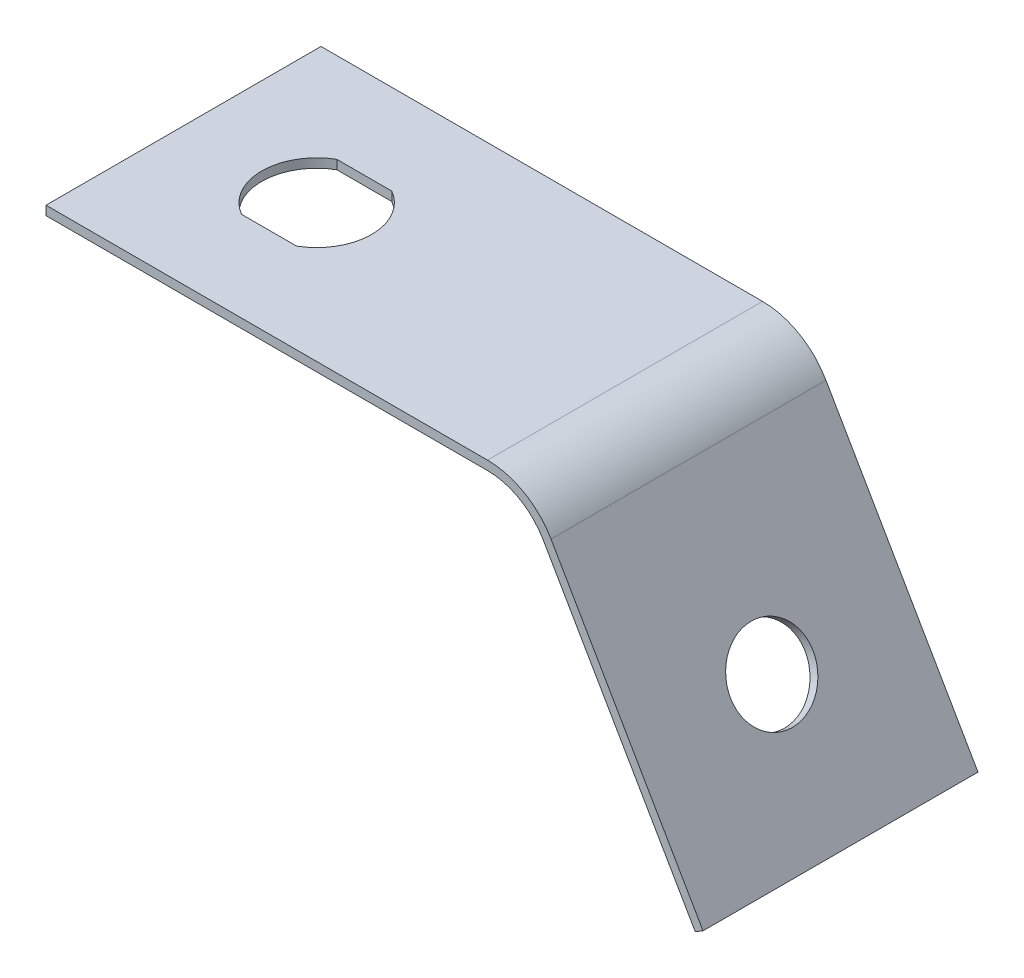
ISO-10303-21;
HEADER;
FILE_DESCRIPTION(('STEP AP214'),'2;1');
FILE_NAME('part.step','',(''),(''),'','','');
FILE_SCHEMA(('AUTOMOTIVE_DESIGN { 1 0 10303 214 1 1 1 1 }'));
ENDSEC;
DATA;
#1=APPLICATION_CONTEXT('core data for automotive mechanical design processes');
#2=APPLICATION_PROTOCOL_DEFINITION('international standard','automotive_design',2000,#1);
#3=PRODUCT_CONTEXT('',#1,'mechanical');
#4=PRODUCT('Part','Part','',(#3));
#5=PRODUCT_RELATED_PRODUCT_CATEGORY('part','',(#4));
#6=PRODUCT_DEFINITION_FORMATION('','',#4);
#7=PRODUCT_DEFINITION_CONTEXT('part definition',#1,'design');
#8=PRODUCT_DEFINITION('design','',#6,#7);
#9=PRODUCT_DEFINITION_SHAPE('','',#8);
#10=(LENGTH_UNIT() NAMED_UNIT(*) SI_UNIT(.MILLI.,.METRE.));
#11=(NAMED_UNIT(*) PLANE_ANGLE_UNIT() SI_UNIT($,.RADIAN.));
#12=(NAMED_UNIT(*) SI_UNIT($,.STERADIAN.) SOLID_ANGLE_UNIT());
#13=UNCERTAINTY_MEASURE_WITH_UNIT(LENGTH_MEASURE(1.E-05),#10,'distance_accuracy_value','');
#14=(GEOMETRIC_REPRESENTATION_CONTEXT(3) GLOBAL_UNCERTAINTY_ASSIGNED_CONTEXT((#13)) GLOBAL_UNIT_ASSIGNED_CONTEXT((#10,
#11,#12)) REPRESENTATION_CONTEXT('',''));
#15=CARTESIAN_POINT('',(0.,0.,0.));
#16=DIRECTION('',(0.,0.,1.));
#17=DIRECTION('',(1.,0.,0.));
#18=AXIS2_PLACEMENT_3D('',#15,#16,#17);
#19=CARTESIAN_POINT('',(1.47013585795091,-3.38455000000012,12.7));
#20=DIRECTION('',(0.866025403784439,0.5,0.));
#21=DIRECTION('',(-0.5,0.866025403784439,0.));
#22=AXIS2_PLACEMENT_3D('',#19,#20,#21);
#23=PLANE('',#22);
#24=CARTESIAN_POINT('',(9.16204875327383,-16.7073339420937,0.));
#25=DIRECTION('',(-0.866025403784439,-0.5,0.));
#26=DIRECTION('',(0.5,-0.866025403784439,0.));
#27=AXIS2_PLACEMENT_3D('',#24,#25,#26);
#28=CIRCLE('',#27,3.81);
#29=CARTESIAN_POINT('',(11.0670487532738,-20.0068907305124,0.));
#30=VERTEX_POINT('',#29);
#31=EDGE_CURVE('E287',#30,#30,#28,.T.);
#32=ORIENTED_EDGE('',*,*,#31,.F.);
#33=EDGE_LOOP('',(#32));
#34=FACE_BOUND('',#33,.T.);
#35=DIRECTION('',(0.5,-0.866025403784439,0.));
#36=VECTOR('',#35,1.);
#37=CARTESIAN_POINT('',(1.47013585795091,-3.38455000000012,-12.7));
#38=LINE('',#37,#36);
#39=CARTESIAN_POINT('',(1.47013585795091,-3.38455000000012,-12.7));
#40=VERTEX_POINT('',#39);
#41=CARTESIAN_POINT('',(15.5120487532738,-27.705856570156,-12.7));
#42=VERTEX_POINT('',#41);
#43=EDGE_CURVE('E160',#40,#42,#38,.T.);
#44=ORIENTED_EDGE('',*,*,#43,.T.);
#45=DIRECTION('',(0.,0.,-1.));
#46=VECTOR('',#45,1.);
#47=CARTESIAN_POINT('',(15.5120487532738,-27.705856570156,12.7));
#48=LINE('',#47,#46);
#49=CARTESIAN_POINT('',(15.5120487532738,-27.705856570156,12.7));
#50=VERTEX_POINT('',#49);
#51=EDGE_CURVE('E246',#50,#42,#48,.T.);
#52=ORIENTED_EDGE('',*,*,#51,.F.);
#53=DIRECTION('',(0.5,-0.866025403784439,0.));
#54=VECTOR('',#53,1.);
#55=CARTESIAN_POINT('',(1.47013585795091,-3.38455000000012,12.7));
#56=LINE('',#55,#54);
#57=CARTESIAN_POINT('',(1.47013585795091,-3.38455000000012,12.7));
#58=VERTEX_POINT('',#57);
#59=EDGE_CURVE('E165',#58,#50,#56,.T.);
#60=ORIENTED_EDGE('',*,*,#59,.F.);
#61=DIRECTION('',(0.,0.,-1.));
#62=VECTOR('',#61,1.);
#63=CARTESIAN_POINT('',(1.47013585795091,-3.38455000000012,12.7));
#64=LINE('',#63,#62);
#65=EDGE_CURVE('E195',#58,#40,#64,.T.);
#66=ORIENTED_EDGE('',*,*,#65,.T.);
#67=EDGE_LOOP('',(#44,#52,#60,#66));
#68=FACE_BOUND('',#67,.T.);
#69=ADVANCED_FACE('F39',(#34,#68),#23,.F.);
#70=CARTESIAN_POINT('',(16.2379512467259,-27.286756570156,12.7));
#71=DIRECTION('',(0.500000000000003,-0.866025403784437,0.));
#72=DIRECTION('',(0.866025403784437,0.500000000000003,0.));
#73=AXIS2_PLACEMENT_3D('',#70,#71,#72);
#74=PLANE('',#73);
#75=DIRECTION('',(-0.866025403784437,-0.500000000000003,0.));
#76=VECTOR('',#75,1.);
#77=CARTESIAN_POINT('',(16.2379512467259,-27.286756570156,-12.7));
#78=LINE('',#77,#76);
#79=CARTESIAN_POINT('',(16.2379512467259,-27.286756570156,-12.7));
#80=VERTEX_POINT('',#79);
#81=EDGE_CURVE('E199',#80,#42,#78,.T.);
#82=ORIENTED_EDGE('',*,*,#81,.F.);
#83=DIRECTION('',(0.,0.,-1.));
#84=VECTOR('',#83,1.);
#85=CARTESIAN_POINT('',(16.2379512467259,-27.286756570156,12.7));
#86=LINE('',#85,#84);
#87=CARTESIAN_POINT('',(16.2379512467259,-27.286756570156,12.7));
#88=VERTEX_POINT('',#87);
#89=EDGE_CURVE('E243',#88,#80,#86,.T.);
#90=ORIENTED_EDGE('',*,*,#89,.F.);
#91=DIRECTION('',(-0.866025403784437,-0.500000000000003,0.));
#92=VECTOR('',#91,1.);
#93=CARTESIAN_POINT('',(16.2379512467259,-27.286756570156,12.7));
#94=LINE('',#93,#92);
#95=EDGE_CURVE('E168',#88,#50,#94,.T.);
#96=ORIENTED_EDGE('',*,*,#95,.T.);
#97=ORIENTED_EDGE('',*,*,#51,.T.);
#98=EDGE_LOOP('',(#82,#90,#96,#97));
#99=FACE_BOUND('',#98,.T.);
#100=ADVANCED_FACE('F277',(#99),#74,.T.);
#101=CARTESIAN_POINT('',(2.19603835140302,-2.96545000000012,12.7));
#102=DIRECTION('',(0.866025403784439,0.5,0.));
#103=DIRECTION('',(-0.5,0.866025403784439,0.));
#104=AXIS2_PLACEMENT_3D('',#101,#102,#103);
#105=PLANE('',#104);
#106=CARTESIAN_POINT('',(9.88795124672594,-16.2882339420937,0.));
#107=DIRECTION('',(0.866025403784439,0.5,0.));
#108=DIRECTION('',(-0.5,0.866025403784439,0.));
#109=AXIS2_PLACEMENT_3D('',#106,#107,#108);
#110=CIRCLE('',#109,3.81);
#111=CARTESIAN_POINT('',(7.98295124672594,-12.9886771536749,0.));
#112=VERTEX_POINT('',#111);
#113=EDGE_CURVE('E42',#112,#112,#110,.T.);
#114=ORIENTED_EDGE('',*,*,#113,.F.);
#115=EDGE_LOOP('',(#114));
#116=FACE_BOUND('',#115,.T.);
#117=DIRECTION('',(0.5,-0.866025403784439,0.));
#118=VECTOR('',#117,1.);
#119=CARTESIAN_POINT('',(2.19603835140302,-2.96545000000012,-12.7));
#120=LINE('',#119,#118);
#121=CARTESIAN_POINT('',(2.19603835140302,-2.96545000000012,-12.7));
#122=VERTEX_POINT('',#121);
#123=EDGE_CURVE('E203',#122,#80,#120,.T.);
#124=ORIENTED_EDGE('',*,*,#123,.F.);
#125=DIRECTION('',(0.,0.,-1.));
#126=VECTOR('',#125,1.);
#127=CARTESIAN_POINT('',(2.19603835140302,-2.96545000000012,12.7));
#128=LINE('',#127,#126);
#129=CARTESIAN_POINT('',(2.19603835140302,-2.96545000000012,12.7));
#130=VERTEX_POINT('',#129);
#131=EDGE_CURVE('E240',#130,#122,#128,.T.);
#132=ORIENTED_EDGE('',*,*,#131,.F.);
#133=DIRECTION('',(0.5,-0.866025403784439,0.));
#134=VECTOR('',#133,1.);
#135=CARTESIAN_POINT('',(2.19603835140302,-2.96545000000012,12.7));
#136=LINE('',#135,#134);
#137=EDGE_CURVE('E173',#130,#88,#136,.T.);
#138=ORIENTED_EDGE('',*,*,#137,.T.);
#139=ORIENTED_EDGE('',*,*,#89,.T.);
#140=EDGE_LOOP('',(#124,#132,#138,#139));
#141=FACE_BOUND('',#140,.T.);
#142=ADVANCED_FACE('F282',(#116,#141),#105,.T.);
#143=CARTESIAN_POINT('',(-3.66617420935424,-6.3500000000001,12.7));
#144=DIRECTION('',(0.,0.,-1.));
#145=DIRECTION('',(-1.,0.,0.));
#146=AXIS2_PLACEMENT_3D('',#143,#144,#145);
#147=CYLINDRICAL_SURFACE('',#146,6.7691);
#148=CARTESIAN_POINT('',(-3.66617420935424,-6.3500000000001,-12.7));
#149=DIRECTION('',(0.,0.,1.));
#150=DIRECTION('',(1.,0.,0.));
#151=AXIS2_PLACEMENT_3D('',#148,#149,#150);
#152=CIRCLE('',#151,6.7691);
#153=CARTESIAN_POINT('',(-3.66617420935427,0.419099999999904,-12.7));
#154=VERTEX_POINT('',#153);
#155=EDGE_CURVE('E207',#154,#122,#152,.F.);
#156=ORIENTED_EDGE('',*,*,#155,.F.);
#157=DIRECTION('',(0.,0.,-1.));
#158=VECTOR('',#157,1.);
#159=CARTESIAN_POINT('',(-3.66617420935427,0.419099999999904,12.7));
#160=LINE('',#159,#158);
#161=CARTESIAN_POINT('',(-3.66617420935427,0.419099999999904,12.7));
#162=VERTEX_POINT('',#161);
#163=EDGE_CURVE('E237',#162,#154,#160,.T.);
#164=ORIENTED_EDGE('',*,*,#163,.F.);
#165=CARTESIAN_POINT('',(-3.66617420935424,-6.3500000000001,12.7));
#166=DIRECTION('',(0.,0.,1.));
#167=DIRECTION('',(1.,0.,0.));
#168=AXIS2_PLACEMENT_3D('',#165,#166,#167);
#169=CIRCLE('',#168,6.7691);
#170=EDGE_CURVE('E177',#162,#130,#169,.F.);
#171=ORIENTED_EDGE('',*,*,#170,.T.);
#172=ORIENTED_EDGE('',*,*,#131,.T.);
#173=EDGE_LOOP('',(#156,#164,#171,#172));
#174=FACE_BOUND('',#173,.T.);
#175=ADVANCED_FACE('F302',(#174),#147,.T.);
#176=CARTESIAN_POINT('',(-44.4500000000001,0.419099999999903,12.7));
#177=DIRECTION('',(0.,1.,0.));
#178=DIRECTION('',(0.,0.,1.));
#179=AXIS2_PLACEMENT_3D('',#176,#177,#178);
#180=PLANE('',#179);
#181=CARTESIAN_POINT('',(-32.149149884402,0.419099999999903,0.));
#182=DIRECTION('',(0.,1.,0.));
#183=DIRECTION('',(0.,0.,1.));
#184=AXIS2_PLACEMENT_3D('',#181,#182,#183);
#185=CIRCLE('',#184,5.08);
#186=CARTESIAN_POINT('',(-34.689149884402,0.419099999999903,-4.39940905122495));
#187=VERTEX_POINT('',#186);
#188=CARTESIAN_POINT('',(-34.689149884402,0.419099999999903,4.39940905122495));
#189=VERTEX_POINT('',#188);
#190=EDGE_CURVE('E55',#187,#189,#185,.T.);
#191=ORIENTED_EDGE('',*,*,#190,.F.);
#192=DIRECTION('',(-1.,0.,0.));
#193=VECTOR('',#192,1.);
#194=CARTESIAN_POINT('',(-34.689149884402,0.419099999999903,-4.39940905122495));
#195=LINE('',#194,#193);
#196=CARTESIAN_POINT('',(-29.609149884402,0.419099999999903,-4.39940905122495));
#197=VERTEX_POINT('',#196);
#198=EDGE_CURVE('E150',#197,#187,#195,.T.);
#199=ORIENTED_EDGE('',*,*,#198,.F.);
#200=CARTESIAN_POINT('',(-32.149149884402,0.419099999999903,0.));
#201=DIRECTION('',(0.,1.,0.));
#202=DIRECTION('',(0.,0.,1.));
#203=AXIS2_PLACEMENT_3D('',#200,#201,#202);
#204=CIRCLE('',#203,5.08);
#205=CARTESIAN_POINT('',(-29.609149884402,0.419099999999903,4.39940905122495));
#206=VERTEX_POINT('',#205);
#207=EDGE_CURVE('E132',#206,#197,#204,.T.);
#208=ORIENTED_EDGE('',*,*,#207,.F.);
#209=DIRECTION('',(1.,0.,0.));
#210=VECTOR('',#209,1.);
#211=CARTESIAN_POINT('',(-29.609149884402,0.419099999999903,4.39940905122495));
#212=LINE('',#211,#210);
#213=EDGE_CURVE('E142',#189,#206,#212,.T.);
#214=ORIENTED_EDGE('',*,*,#213,.F.);
#215=EDGE_LOOP('',(#191,#199,#208,#214));
#216=FACE_BOUND('',#215,.T.);
#217=DIRECTION('',(1.,0.,0.));
#218=VECTOR('',#217,1.);
#219=CARTESIAN_POINT('',(-44.4500000000001,0.419099999999903,-12.7));
#220=LINE('',#219,#218);
#221=CARTESIAN_POINT('',(-44.4500000000001,0.419099999999903,-12.7));
#222=VERTEX_POINT('',#221);
#223=EDGE_CURVE('E211',#222,#154,#220,.T.);
#224=ORIENTED_EDGE('',*,*,#223,.F.);
#225=DIRECTION('',(0.,0.,-1.));
#226=VECTOR('',#225,1.);
#227=CARTESIAN_POINT('',(-44.4500000000001,0.419099999999903,12.7));
#228=LINE('',#227,#226);
#229=CARTESIAN_POINT('',(-44.4500000000001,0.419099999999903,12.7));
#230=VERTEX_POINT('',#229);
#231=EDGE_CURVE('E234',#230,#222,#228,.T.);
#232=ORIENTED_EDGE('',*,*,#231,.F.);
#233=DIRECTION('',(1.,0.,0.));
#234=VECTOR('',#233,1.);
#235=CARTESIAN_POINT('',(-44.4500000000001,0.419099999999903,12.7));
#236=LINE('',#235,#234);
#237=EDGE_CURVE('E181',#230,#162,#236,.T.);
#238=ORIENTED_EDGE('',*,*,#237,.T.);
#239=ORIENTED_EDGE('',*,*,#163,.T.);
#240=EDGE_LOOP('',(#224,#232,#238,#239));
#241=FACE_BOUND('',#240,.T.);
#242=ADVANCED_FACE('F147',(#216,#241),#180,.T.);
#243=CARTESIAN_POINT('',(-44.4500000000001,-0.419100000000097,12.7));
#244=DIRECTION('',(-1.,0.,0.));
#245=DIRECTION('',(0.,0.,1.));
#246=AXIS2_PLACEMENT_3D('',#243,#244,#245);
#247=PLANE('',#246);
#248=DIRECTION('',(0.,1.,0.));
#249=VECTOR('',#248,1.);
#250=CARTESIAN_POINT('',(-44.4500000000001,-0.419100000000097,-12.7));
#251=LINE('',#250,#249);
#252=CARTESIAN_POINT('',(-44.4500000000001,-0.419100000000097,-12.7));
#253=VERTEX_POINT('',#252);
#254=EDGE_CURVE('E215',#253,#222,#251,.T.);
#255=ORIENTED_EDGE('',*,*,#254,.F.);
#256=DIRECTION('',(0.,0.,-1.));
#257=VECTOR('',#256,1.);
#258=CARTESIAN_POINT('',(-44.4500000000001,-0.419100000000097,12.7));
#259=LINE('',#258,#257);
#260=CARTESIAN_POINT('',(-44.4500000000001,-0.419100000000097,12.7));
#261=VERTEX_POINT('',#260);
#262=EDGE_CURVE('E231',#261,#253,#259,.T.);
#263=ORIENTED_EDGE('',*,*,#262,.F.);
#264=DIRECTION('',(0.,1.,0.));
#265=VECTOR('',#264,1.);
#266=CARTESIAN_POINT('',(-44.4500000000001,-0.419100000000097,12.7));
#267=LINE('',#266,#265);
#268=EDGE_CURVE('E185',#261,#230,#267,.T.);
#269=ORIENTED_EDGE('',*,*,#268,.T.);
#270=ORIENTED_EDGE('',*,*,#231,.T.);
#271=EDGE_LOOP('',(#255,#263,#269,#270));
#272=FACE_BOUND('',#271,.T.);
#273=ADVANCED_FACE('F308',(#272),#247,.T.);
#274=CARTESIAN_POINT('',(-44.4500000000001,-0.419100000000097,12.7));
#275=DIRECTION('',(0.,1.,0.));
#276=DIRECTION('',(0.,0.,1.));
#277=AXIS2_PLACEMENT_3D('',#274,#275,#276);
#278=PLANE('',#277);
#279=DIRECTION('',(-1.,0.,0.));
#280=VECTOR('',#279,1.);
#281=CARTESIAN_POINT('',(-44.4500000000001,-0.419100000000097,-4.39940905122495));
#282=LINE('',#281,#280);
#283=CARTESIAN_POINT('',(-29.609149884402,-0.419100000000103,-4.39940905122495));
#284=VERTEX_POINT('',#283);
#285=CARTESIAN_POINT('',(-34.689149884402,-0.419100000000103,-4.39940905122495));
#286=VERTEX_POINT('',#285);
#287=EDGE_CURVE('E48',#284,#286,#282,.T.);
#288=ORIENTED_EDGE('',*,*,#287,.T.);
#289=CARTESIAN_POINT('',(-32.149149884402,-0.419100000000096,0.));
#290=DIRECTION('',(0.,1.,0.));
#291=DIRECTION('',(0.,0.,1.));
#292=AXIS2_PLACEMENT_3D('',#289,#290,#291);
#293=CIRCLE('',#292,5.08);
#294=CARTESIAN_POINT('',(-34.689149884402,-0.419100000000103,4.39940905122495));
#295=VERTEX_POINT('',#294);
#296=EDGE_CURVE('E11',#286,#295,#293,.T.);
#297=ORIENTED_EDGE('',*,*,#296,.T.);
#298=DIRECTION('',(1.,0.,0.));
#299=VECTOR('',#298,1.);
#300=CARTESIAN_POINT('',(-44.4500000000001,-0.419100000000097,4.39940905122495));
#301=LINE('',#300,#299);
#302=CARTESIAN_POINT('',(-29.609149884402,-0.419100000000097,4.39940905122495));
#303=VERTEX_POINT('',#302);
#304=EDGE_CURVE('E249',#295,#303,#301,.T.);
#305=ORIENTED_EDGE('',*,*,#304,.T.);
#306=CARTESIAN_POINT('',(-32.149149884402,-0.419100000000096,0.));
#307=DIRECTION('',(0.,1.,0.));
#308=DIRECTION('',(0.,0.,1.));
#309=AXIS2_PLACEMENT_3D('',#306,#307,#308);
#310=CIRCLE('',#309,5.08);
#311=EDGE_CURVE('E135',#303,#284,#310,.T.);
#312=ORIENTED_EDGE('',*,*,#311,.T.);
#313=EDGE_LOOP('',(#288,#297,#305,#312));
#314=FACE_BOUND('',#313,.T.);
#315=DIRECTION('',(1.,0.,0.));
#316=VECTOR('',#315,1.);
#317=CARTESIAN_POINT('',(-44.4500000000001,-0.419100000000097,-12.7));
#318=LINE('',#317,#316);
#319=CARTESIAN_POINT('',(-3.66617420935426,-0.419100000000097,-12.7));
#320=VERTEX_POINT('',#319);
#321=EDGE_CURVE('E219',#253,#320,#318,.T.);
#322=ORIENTED_EDGE('',*,*,#321,.T.);
#323=DIRECTION('',(0.,0.,-1.));
#324=VECTOR('',#323,1.);
#325=CARTESIAN_POINT('',(-3.66617420935426,-0.419100000000097,12.7));
#326=LINE('',#325,#324);
#327=CARTESIAN_POINT('',(-3.66617420935426,-0.419100000000097,12.7));
#328=VERTEX_POINT('',#327);
#329=EDGE_CURVE('E227',#328,#320,#326,.T.);
#330=ORIENTED_EDGE('',*,*,#329,.F.);
#331=DIRECTION('',(1.,0.,0.));
#332=VECTOR('',#331,1.);
#333=CARTESIAN_POINT('',(-44.4500000000001,-0.419100000000097,12.7));
#334=LINE('',#333,#332);
#335=EDGE_CURVE('E189',#261,#328,#334,.T.);
#336=ORIENTED_EDGE('',*,*,#335,.F.);
#337=ORIENTED_EDGE('',*,*,#262,.T.);
#338=EDGE_LOOP('',(#322,#330,#336,#337));
#339=FACE_BOUND('',#338,.T.);
#340=ADVANCED_FACE('F257',(#314,#339),#278,.F.);
#341=CARTESIAN_POINT('',(-3.66617420935424,-6.3500000000001,12.7));
#342=DIRECTION('',(0.,0.,-1.));
#343=DIRECTION('',(-1.,0.,0.));
#344=AXIS2_PLACEMENT_3D('',#341,#342,#343);
#345=CYLINDRICAL_SURFACE('',#344,5.9309);
#346=CARTESIAN_POINT('',(-3.66617420935424,-6.3500000000001,-12.7));
#347=DIRECTION('',(0.,0.,1.));
#348=DIRECTION('',(1.,0.,0.));
#349=AXIS2_PLACEMENT_3D('',#346,#347,#348);
#350=CIRCLE('',#349,5.9309);
#351=EDGE_CURVE('E169',#320,#40,#350,.F.);
#352=ORIENTED_EDGE('',*,*,#351,.T.);
#353=ORIENTED_EDGE('',*,*,#65,.F.);
#354=CARTESIAN_POINT('',(-3.66617420935424,-6.3500000000001,12.7));
#355=DIRECTION('',(0.,0.,1.));
#356=DIRECTION('',(1.,0.,0.));
#357=AXIS2_PLACEMENT_3D('',#354,#355,#356);
#358=CIRCLE('',#357,5.9309);
#359=EDGE_CURVE('E192',#328,#58,#358,.F.);
#360=ORIENTED_EDGE('',*,*,#359,.F.);
#361=ORIENTED_EDGE('',*,*,#329,.T.);
#362=EDGE_LOOP('',(#352,#353,#360,#361));
#363=FACE_BOUND('',#362,.T.);
#364=ADVANCED_FACE('F314',(#363),#345,.F.);
#365=CARTESIAN_POINT('',(-3.66617420935424,-6.3500000000001,12.7));
#366=DIRECTION('',(0.,0.,1.));
#367=DIRECTION('',(1.,0.,0.));
#368=AXIS2_PLACEMENT_3D('',#365,#366,#367);
#369=PLANE('',#368);
#370=ORIENTED_EDGE('',*,*,#59,.T.);
#371=ORIENTED_EDGE('',*,*,#95,.F.);
#372=ORIENTED_EDGE('',*,*,#137,.F.);
#373=ORIENTED_EDGE('',*,*,#170,.F.);
#374=ORIENTED_EDGE('',*,*,#237,.F.);
#375=ORIENTED_EDGE('',*,*,#268,.F.);
#376=ORIENTED_EDGE('',*,*,#335,.T.);
#377=ORIENTED_EDGE('',*,*,#359,.T.);
#378=EDGE_LOOP('',(#370,#371,#372,#373,#374,#375,#376,#377));
#379=FACE_BOUND('',#378,.T.);
#380=ADVANCED_FACE('F271',(#379),#369,.T.);
#381=CARTESIAN_POINT('',(-3.66617420935424,-6.3500000000001,-12.7));
#382=DIRECTION('',(0.,0.,1.));
#383=DIRECTION('',(1.,0.,0.));
#384=AXIS2_PLACEMENT_3D('',#381,#382,#383);
#385=PLANE('',#384);
#386=ORIENTED_EDGE('',*,*,#43,.F.);
#387=ORIENTED_EDGE('',*,*,#351,.F.);
#388=ORIENTED_EDGE('',*,*,#321,.F.);
#389=ORIENTED_EDGE('',*,*,#254,.T.);
#390=ORIENTED_EDGE('',*,*,#223,.T.);
#391=ORIENTED_EDGE('',*,*,#155,.T.);
#392=ORIENTED_EDGE('',*,*,#123,.T.);
#393=ORIENTED_EDGE('',*,*,#81,.T.);
#394=EDGE_LOOP('',(#386,#387,#388,#389,#390,#391,#392,#393));
#395=FACE_BOUND('',#394,.T.);
#396=ADVANCED_FACE('F264',(#395),#385,.F.);
#397=CARTESIAN_POINT('',(-32.149149884402,-27.705856570156,0.));
#398=DIRECTION('',(0.,1.,0.));
#399=DIRECTION('',(0.,0.,1.));
#400=AXIS2_PLACEMENT_3D('',#397,#398,#399);
#401=CYLINDRICAL_SURFACE('',#400,5.08);
#402=DIRECTION('',(0.,1.,0.));
#403=VECTOR('',#402,1.);
#404=CARTESIAN_POINT('',(-34.689149884402,-27.705856570156,-4.39940905122495));
#405=LINE('',#404,#403);
#406=EDGE_CURVE('E157',#286,#187,#405,.T.);
#407=ORIENTED_EDGE('',*,*,#406,.T.);
#408=ORIENTED_EDGE('',*,*,#190,.T.);
#409=DIRECTION('',(0.,1.,0.));
#410=VECTOR('',#409,1.);
#411=CARTESIAN_POINT('',(-34.689149884402,-27.705856570156,4.39940905122495));
#412=LINE('',#411,#410);
#413=EDGE_CURVE('E139',#295,#189,#412,.T.);
#414=ORIENTED_EDGE('',*,*,#413,.F.);
#415=ORIENTED_EDGE('',*,*,#296,.F.);
#416=EDGE_LOOP('',(#407,#408,#414,#415));
#417=FACE_BOUND('',#416,.T.);
#418=ADVANCED_FACE('F262',(#417),#401,.F.);
#419=CARTESIAN_POINT('',(-34.689149884402,-27.705856570156,-4.39940905122495));
#420=DIRECTION('',(0.,0.,-1.));
#421=DIRECTION('',(-1.,0.,0.));
#422=AXIS2_PLACEMENT_3D('',#419,#420,#421);
#423=PLANE('',#422);
#424=DIRECTION('',(0.,1.,0.));
#425=VECTOR('',#424,1.);
#426=CARTESIAN_POINT('',(-29.609149884402,-27.705856570156,-4.39940905122495));
#427=LINE('',#426,#425);
#428=EDGE_CURVE('E138',#284,#197,#427,.T.);
#429=ORIENTED_EDGE('',*,*,#428,.T.);
#430=ORIENTED_EDGE('',*,*,#198,.T.);
#431=ORIENTED_EDGE('',*,*,#406,.F.);
#432=ORIENTED_EDGE('',*,*,#287,.F.);
#433=EDGE_LOOP('',(#429,#430,#431,#432));
#434=FACE_BOUND('',#433,.T.);
#435=ADVANCED_FACE('F261',(#434),#423,.F.);
#436=CARTESIAN_POINT('',(-32.149149884402,-27.705856570156,0.));
#437=DIRECTION('',(0.,1.,0.));
#438=DIRECTION('',(0.,0.,1.));
#439=AXIS2_PLACEMENT_3D('',#436,#437,#438);
#440=CYLINDRICAL_SURFACE('',#439,5.08);
#441=DIRECTION('',(0.,1.,0.));
#442=VECTOR('',#441,1.);
#443=CARTESIAN_POINT('',(-29.609149884402,-27.705856570156,4.39940905122495));
#444=LINE('',#443,#442);
#445=EDGE_CURVE('E63',#303,#206,#444,.T.);
#446=ORIENTED_EDGE('',*,*,#445,.T.);
#447=ORIENTED_EDGE('',*,*,#207,.T.);
#448=ORIENTED_EDGE('',*,*,#428,.F.);
#449=ORIENTED_EDGE('',*,*,#311,.F.);
#450=EDGE_LOOP('',(#446,#447,#448,#449));
#451=FACE_BOUND('',#450,.T.);
#452=ADVANCED_FACE('F129',(#451),#440,.F.);
#453=CARTESIAN_POINT('',(-29.609149884402,-27.705856570156,4.39940905122495));
#454=DIRECTION('',(0.,0.,1.));
#455=DIRECTION('',(1.,0.,0.));
#456=AXIS2_PLACEMENT_3D('',#453,#454,#455);
#457=PLANE('',#456);
#458=ORIENTED_EDGE('',*,*,#413,.T.);
#459=ORIENTED_EDGE('',*,*,#213,.T.);
#460=ORIENTED_EDGE('',*,*,#445,.F.);
#461=ORIENTED_EDGE('',*,*,#304,.F.);
#462=EDGE_LOOP('',(#458,#459,#460,#461));
#463=FACE_BOUND('',#462,.T.);
#464=ADVANCED_FACE('F143',(#463),#457,.F.);
#465=CARTESIAN_POINT('',(21.8849390584075,-9.36176979955468,0.));
#466=DIRECTION('',(-0.866025403784439,-0.5,0.));
#467=DIRECTION('',(0.5,-0.866025403784439,0.));
#468=AXIS2_PLACEMENT_3D('',#465,#466,#467);
#469=CYLINDRICAL_SURFACE('',#468,3.81);
#470=ORIENTED_EDGE('',*,*,#113,.T.);
#471=EDGE_LOOP('',(#470));
#472=FACE_BOUND('',#471,.T.);
#473=ORIENTED_EDGE('',*,*,#31,.T.);
#474=EDGE_LOOP('',(#473));
#475=FACE_BOUND('',#474,.T.);
#476=ADVANCED_FACE('F341',(#472,#475),#469,.F.);
#477=CLOSED_SHELL('',(#69,#100,#142,#175,#242,#273,#340,#364,#380,#396,#418,#435,#452,#464,#476));
#478=MANIFOLD_SOLID_BREP('B2',#477);
#479=ADVANCED_BREP_SHAPE_REPRESENTATION('',(#18,#478),#14);
#480=SHAPE_DEFINITION_REPRESENTATION(#9,#479);
ENDSEC;
END-ISO-10303-21;
